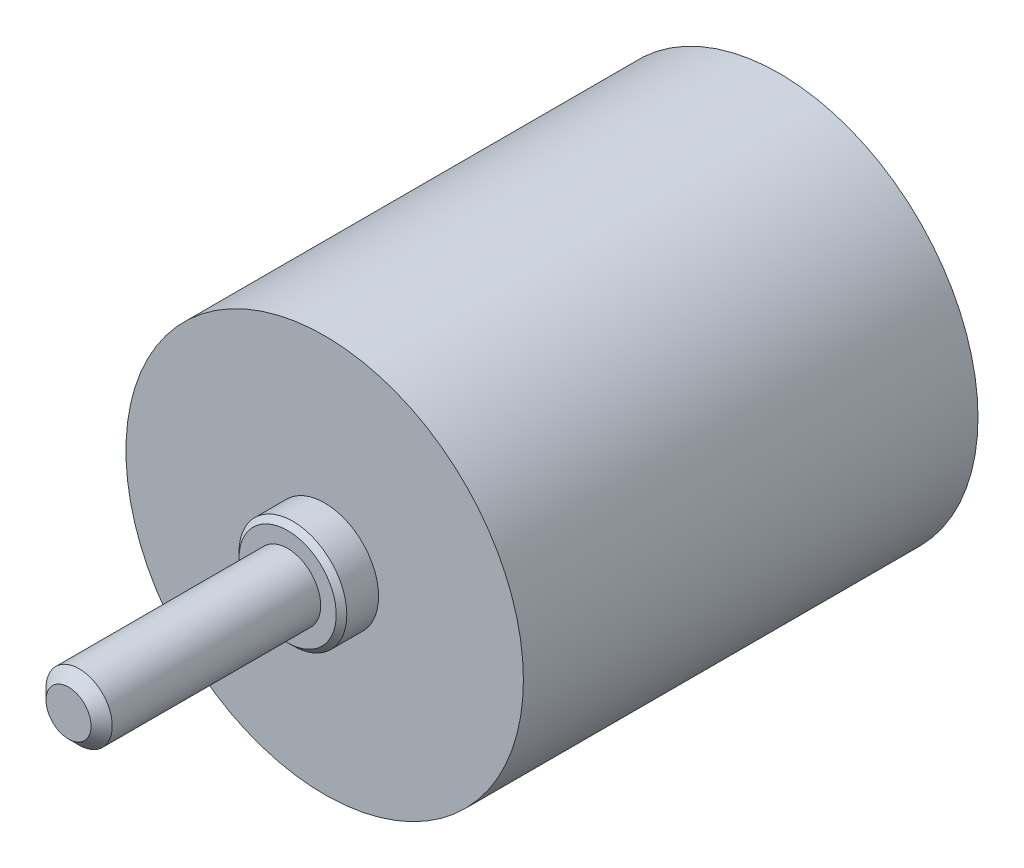
ISO-10303-21;
HEADER;
FILE_DESCRIPTION(('STEP AP214'),'2;1');
FILE_NAME('part.step','',(''),(''),'','','');
FILE_SCHEMA(('AUTOMOTIVE_DESIGN { 1 0 10303 214 1 1 1 1 }'));
ENDSEC;
DATA;
#1=APPLICATION_CONTEXT('core data for automotive mechanical design processes');
#2=APPLICATION_PROTOCOL_DEFINITION('international standard','automotive_design',2000,#1);
#3=PRODUCT_CONTEXT('',#1,'mechanical');
#4=PRODUCT('Part','Part','',(#3));
#5=PRODUCT_RELATED_PRODUCT_CATEGORY('part','',(#4));
#6=PRODUCT_DEFINITION_FORMATION('','',#4);
#7=PRODUCT_DEFINITION_CONTEXT('part definition',#1,'design');
#8=PRODUCT_DEFINITION('design','',#6,#7);
#9=PRODUCT_DEFINITION_SHAPE('','',#8);
#10=(LENGTH_UNIT() NAMED_UNIT(*) SI_UNIT(.MILLI.,.METRE.));
#11=(NAMED_UNIT(*) PLANE_ANGLE_UNIT() SI_UNIT($,.RADIAN.));
#12=(NAMED_UNIT(*) SI_UNIT($,.STERADIAN.) SOLID_ANGLE_UNIT());
#13=UNCERTAINTY_MEASURE_WITH_UNIT(LENGTH_MEASURE(1.E-05),#10,'distance_accuracy_value','');
#14=(GEOMETRIC_REPRESENTATION_CONTEXT(3) GLOBAL_UNCERTAINTY_ASSIGNED_CONTEXT((#13)) GLOBAL_UNIT_ASSIGNED_CONTEXT((#10,
#11,#12)) REPRESENTATION_CONTEXT('',''));
#15=CARTESIAN_POINT('',(0.,0.,0.));
#16=DIRECTION('',(0.,0.,1.));
#17=DIRECTION('',(1.,0.,0.));
#18=AXIS2_PLACEMENT_3D('',#15,#16,#17);
#19=CARTESIAN_POINT('',(0.,0.,0.));
#20=DIRECTION('',(0.,0.,-1.));
#21=DIRECTION('',(-1.,0.,0.));
#22=AXIS2_PLACEMENT_3D('',#19,#20,#21);
#23=PLANE('',#22);
#24=CARTESIAN_POINT('',(0.,0.,0.));
#25=DIRECTION('',(0.,0.,-1.));
#26=DIRECTION('',(-1.,0.,0.));
#27=AXIS2_PLACEMENT_3D('',#24,#25,#26);
#28=CIRCLE('',#27,2.15899999999999);
#29=CARTESIAN_POINT('',(-2.15899999999999,0.,0.));
#30=VERTEX_POINT('',#29);
#31=EDGE_CURVE('E79',#30,#30,#28,.F.);
#32=ORIENTED_EDGE('',*,*,#31,.T.);
#33=EDGE_LOOP('',(#32));
#34=FACE_BOUND('',#33,.T.);
#35=ADVANCED_FACE('F51',(#34),#23,.F.);
#36=CARTESIAN_POINT('',(0.,0.,0.));
#37=DIRECTION('',(0.,0.,1.));
#38=DIRECTION('',(1.,0.,0.));
#39=AXIS2_PLACEMENT_3D('',#36,#37,#38);
#40=CYLINDRICAL_SURFACE('',#39,3.175);
#41=CARTESIAN_POINT('',(0.,0.,-1.016));
#42=DIRECTION('',(0.,0.,-1.));
#43=DIRECTION('',(-1.,0.,0.));
#44=AXIS2_PLACEMENT_3D('',#41,#42,#43);
#45=CIRCLE('',#44,3.175);
#46=CARTESIAN_POINT('',(-3.175,0.,-1.016));
#47=VERTEX_POINT('',#46);
#48=EDGE_CURVE('E75',#47,#47,#45,.T.);
#49=ORIENTED_EDGE('',*,*,#48,.T.);
#50=EDGE_LOOP('',(#49));
#51=FACE_BOUND('',#50,.T.);
#52=CARTESIAN_POINT('',(0.,0.,-21.));
#53=DIRECTION('',(0.,0.,1.));
#54=DIRECTION('',(1.,0.,0.));
#55=AXIS2_PLACEMENT_3D('',#52,#53,#54);
#56=CIRCLE('',#55,3.175);
#57=CARTESIAN_POINT('',(3.175,0.,-21.));
#58=VERTEX_POINT('',#57);
#59=EDGE_CURVE('E83',#58,#58,#56,.T.);
#60=ORIENTED_EDGE('',*,*,#59,.T.);
#61=EDGE_LOOP('',(#60));
#62=FACE_BOUND('',#61,.T.);
#63=ADVANCED_FACE('F123',(#51,#62),#40,.T.);
#64=CARTESIAN_POINT('',(0.,3.175,-21.));
#65=DIRECTION('',(0.,0.,-1.));
#66=DIRECTION('',(-1.,0.,0.));
#67=AXIS2_PLACEMENT_3D('',#64,#65,#66);
#68=PLANE('',#67);
#69=CARTESIAN_POINT('',(0.,0.,-21.));
#70=DIRECTION('',(0.,0.,-1.));
#71=DIRECTION('',(-1.,0.,0.));
#72=AXIS2_PLACEMENT_3D('',#69,#70,#71);
#73=CIRCLE('',#72,4.66090000000001);
#74=CARTESIAN_POINT('',(-4.66090000000001,0.,-21.));
#75=VERTEX_POINT('',#74);
#76=EDGE_CURVE('E59',#75,#75,#73,.F.);
#77=ORIENTED_EDGE('',*,*,#76,.T.);
#78=EDGE_LOOP('',(#77));
#79=FACE_BOUND('',#78,.T.);
#80=ORIENTED_EDGE('',*,*,#59,.F.);
#81=EDGE_LOOP('',(#80));
#82=FACE_BOUND('',#81,.T.);
#83=ADVANCED_FACE('F129',(#79,#82),#68,.F.);
#84=CARTESIAN_POINT('',(0.,0.,0.));
#85=DIRECTION('',(0.,0.,1.));
#86=DIRECTION('',(1.,0.,0.));
#87=AXIS2_PLACEMENT_3D('',#84,#85,#86);
#88=CYLINDRICAL_SURFACE('',#87,5.1689);
#89=CARTESIAN_POINT('',(0.,0.,-21.508));
#90=DIRECTION('',(0.,0.,-1.));
#91=DIRECTION('',(-1.,0.,0.));
#92=AXIS2_PLACEMENT_3D('',#89,#90,#91);
#93=CIRCLE('',#92,5.1689);
#94=CARTESIAN_POINT('',(-5.1689,0.,-21.508));
#95=VERTEX_POINT('',#94);
#96=EDGE_CURVE('E11',#95,#95,#93,.T.);
#97=ORIENTED_EDGE('',*,*,#96,.T.);
#98=EDGE_LOOP('',(#97));
#99=FACE_BOUND('',#98,.T.);
#100=CARTESIAN_POINT('',(0.,0.,-24.556));
#101=DIRECTION('',(0.,0.,1.));
#102=DIRECTION('',(1.,0.,0.));
#103=AXIS2_PLACEMENT_3D('',#100,#101,#102);
#104=CIRCLE('',#103,5.1689);
#105=CARTESIAN_POINT('',(5.1689,0.,-24.556));
#106=VERTEX_POINT('',#105);
#107=EDGE_CURVE('E87',#106,#106,#104,.T.);
#108=ORIENTED_EDGE('',*,*,#107,.T.);
#109=EDGE_LOOP('',(#108));
#110=FACE_BOUND('',#109,.T.);
#111=ADVANCED_FACE('F181',(#99,#110),#88,.T.);
#112=CARTESIAN_POINT('',(0.,5.1689,-24.556));
#113=DIRECTION('',(0.,0.,-1.));
#114=DIRECTION('',(-1.,0.,0.));
#115=AXIS2_PLACEMENT_3D('',#112,#113,#114);
#116=PLANE('',#115);
#117=ORIENTED_EDGE('',*,*,#107,.F.);
#118=EDGE_LOOP('',(#117));
#119=FACE_BOUND('',#118,.T.);
#120=CARTESIAN_POINT('',(0.,0.,-24.556));
#121=DIRECTION('',(0.,0.,1.));
#122=DIRECTION('',(1.,0.,0.));
#123=AXIS2_PLACEMENT_3D('',#120,#121,#122);
#124=CIRCLE('',#123,19.05);
#125=CARTESIAN_POINT('',(19.05,0.,-24.556));
#126=VERTEX_POINT('',#125);
#127=EDGE_CURVE('E91',#126,#126,#124,.T.);
#128=ORIENTED_EDGE('',*,*,#127,.T.);
#129=EDGE_LOOP('',(#128));
#130=FACE_BOUND('',#129,.T.);
#131=ADVANCED_FACE('F173',(#119,#130),#116,.F.);
#132=CARTESIAN_POINT('',(0.,0.,0.));
#133=DIRECTION('',(0.,0.,1.));
#134=DIRECTION('',(1.,0.,0.));
#135=AXIS2_PLACEMENT_3D('',#132,#133,#134);
#136=CYLINDRICAL_SURFACE('',#135,19.05);
#137=ORIENTED_EDGE('',*,*,#127,.F.);
#138=EDGE_LOOP('',(#137));
#139=FACE_BOUND('',#138,.T.);
#140=CARTESIAN_POINT('',(0.,0.,-68.1347493653523));
#141=DIRECTION('',(0.,0.,1.));
#142=DIRECTION('',(1.,0.,0.));
#143=AXIS2_PLACEMENT_3D('',#140,#141,#142);
#144=CIRCLE('',#143,19.05);
#145=CARTESIAN_POINT('',(19.05,0.,-68.1347493653523));
#146=VERTEX_POINT('',#145);
#147=EDGE_CURVE('E95',#146,#146,#144,.T.);
#148=ORIENTED_EDGE('',*,*,#147,.T.);
#149=EDGE_LOOP('',(#148));
#150=FACE_BOUND('',#149,.T.);
#151=ADVANCED_FACE('F119',(#139,#150),#136,.T.);
#152=CARTESIAN_POINT('',(0.,19.05,-68.1347493653523));
#153=DIRECTION('',(0.,0.,1.));
#154=DIRECTION('',(1.,0.,0.));
#155=AXIS2_PLACEMENT_3D('',#152,#153,#154);
#156=PLANE('',#155);
#157=ORIENTED_EDGE('',*,*,#147,.F.);
#158=EDGE_LOOP('',(#157));
#159=FACE_BOUND('',#158,.T.);
#160=CARTESIAN_POINT('',(0.,0.,-68.1347493653523));
#161=DIRECTION('',(0.,0.,1.));
#162=DIRECTION('',(1.,0.,0.));
#163=AXIS2_PLACEMENT_3D('',#160,#161,#162);
#164=CIRCLE('',#163,5.1689);
#165=CARTESIAN_POINT('',(5.1689,0.,-68.1347493653523));
#166=VERTEX_POINT('',#165);
#167=EDGE_CURVE('E99',#166,#166,#164,.T.);
#168=ORIENTED_EDGE('',*,*,#167,.T.);
#169=EDGE_LOOP('',(#168));
#170=FACE_BOUND('',#169,.T.);
#171=ADVANCED_FACE('F104',(#159,#170),#156,.F.);
#172=CARTESIAN_POINT('',(0.,0.,0.));
#173=DIRECTION('',(0.,0.,1.));
#174=DIRECTION('',(1.,0.,0.));
#175=AXIS2_PLACEMENT_3D('',#172,#173,#174);
#176=CYLINDRICAL_SURFACE('',#175,5.1689);
#177=CARTESIAN_POINT('',(0.,0.,-72.2884));
#178=DIRECTION('',(0.,0.,1.));
#179=DIRECTION('',(1.,0.,0.));
#180=AXIS2_PLACEMENT_3D('',#177,#178,#179);
#181=CIRCLE('',#180,5.1689);
#182=CARTESIAN_POINT('',(5.1689,0.,-72.2884));
#183=VERTEX_POINT('',#182);
#184=EDGE_CURVE('E69',#183,#183,#181,.T.);
#185=ORIENTED_EDGE('',*,*,#184,.T.);
#186=EDGE_LOOP('',(#185));
#187=FACE_BOUND('',#186,.T.);
#188=ORIENTED_EDGE('',*,*,#167,.F.);
#189=EDGE_LOOP('',(#188));
#190=FACE_BOUND('',#189,.T.);
#191=ADVANCED_FACE('F106',(#187,#190),#176,.T.);
#192=CARTESIAN_POINT('',(0.,5.1689,-72.7964));
#193=DIRECTION('',(0.,0.,1.));
#194=DIRECTION('',(1.,0.,0.));
#195=AXIS2_PLACEMENT_3D('',#192,#193,#194);
#196=PLANE('',#195);
#197=CARTESIAN_POINT('',(0.,0.,-72.7964));
#198=DIRECTION('',(0.,0.,1.));
#199=DIRECTION('',(1.,0.,0.));
#200=AXIS2_PLACEMENT_3D('',#197,#198,#199);
#201=CIRCLE('',#200,4.66089999999999);
#202=CARTESIAN_POINT('',(4.66089999999999,0.,-72.7964));
#203=VERTEX_POINT('',#202);
#204=EDGE_CURVE('E64',#203,#203,#201,.F.);
#205=ORIENTED_EDGE('',*,*,#204,.T.);
#206=EDGE_LOOP('',(#205));
#207=FACE_BOUND('',#206,.T.);
#208=ADVANCED_FACE('F108',(#207),#196,.F.);
#209=CARTESIAN_POINT('',(0.,0.,0.));
#210=DIRECTION('',(0.,0.,-1.));
#211=DIRECTION('',(-1.,0.,0.));
#212=AXIS2_PLACEMENT_3D('',#209,#210,#211);
#213=CONICAL_SURFACE('',#212,2.15899999999999,0.78539816339745);
#214=ORIENTED_EDGE('',*,*,#48,.F.);
#215=EDGE_LOOP('',(#214));
#216=FACE_BOUND('',#215,.T.);
#217=ORIENTED_EDGE('',*,*,#31,.F.);
#218=EDGE_LOOP('',(#217));
#219=FACE_BOUND('',#218,.T.);
#220=ADVANCED_FACE('F115',(#216,#219),#213,.T.);
#221=CARTESIAN_POINT('',(0.,0.,-72.2884));
#222=DIRECTION('',(0.,0.,1.));
#223=DIRECTION('',(1.,0.,0.));
#224=AXIS2_PLACEMENT_3D('',#221,#222,#223);
#225=CONICAL_SURFACE('',#224,5.1689,0.785398163397453);
#226=ORIENTED_EDGE('',*,*,#204,.F.);
#227=EDGE_LOOP('',(#226));
#228=FACE_BOUND('',#227,.T.);
#229=ORIENTED_EDGE('',*,*,#184,.F.);
#230=EDGE_LOOP('',(#229));
#231=FACE_BOUND('',#230,.T.);
#232=ADVANCED_FACE('F135',(#228,#231),#225,.T.);
#233=CARTESIAN_POINT('',(0.,0.,-21.));
#234=DIRECTION('',(0.,0.,-1.));
#235=DIRECTION('',(-1.,0.,0.));
#236=AXIS2_PLACEMENT_3D('',#233,#234,#235);
#237=CONICAL_SURFACE('',#236,4.66090000000001,0.785398163397458);
#238=ORIENTED_EDGE('',*,*,#96,.F.);
#239=EDGE_LOOP('',(#238));
#240=FACE_BOUND('',#239,.T.);
#241=ORIENTED_EDGE('',*,*,#76,.F.);
#242=EDGE_LOOP('',(#241));
#243=FACE_BOUND('',#242,.T.);
#244=ADVANCED_FACE('F53',(#240,#243),#237,.T.);
#245=CLOSED_SHELL('',(#35,#63,#83,#111,#131,#151,#171,#191,#208,#220,#232,#244));
#246=MANIFOLD_SOLID_BREP('B2',#245);
#247=ADVANCED_BREP_SHAPE_REPRESENTATION('',(#18,#246),#14);
#248=SHAPE_DEFINITION_REPRESENTATION(#9,#247);
ENDSEC;
END-ISO-10303-21;
